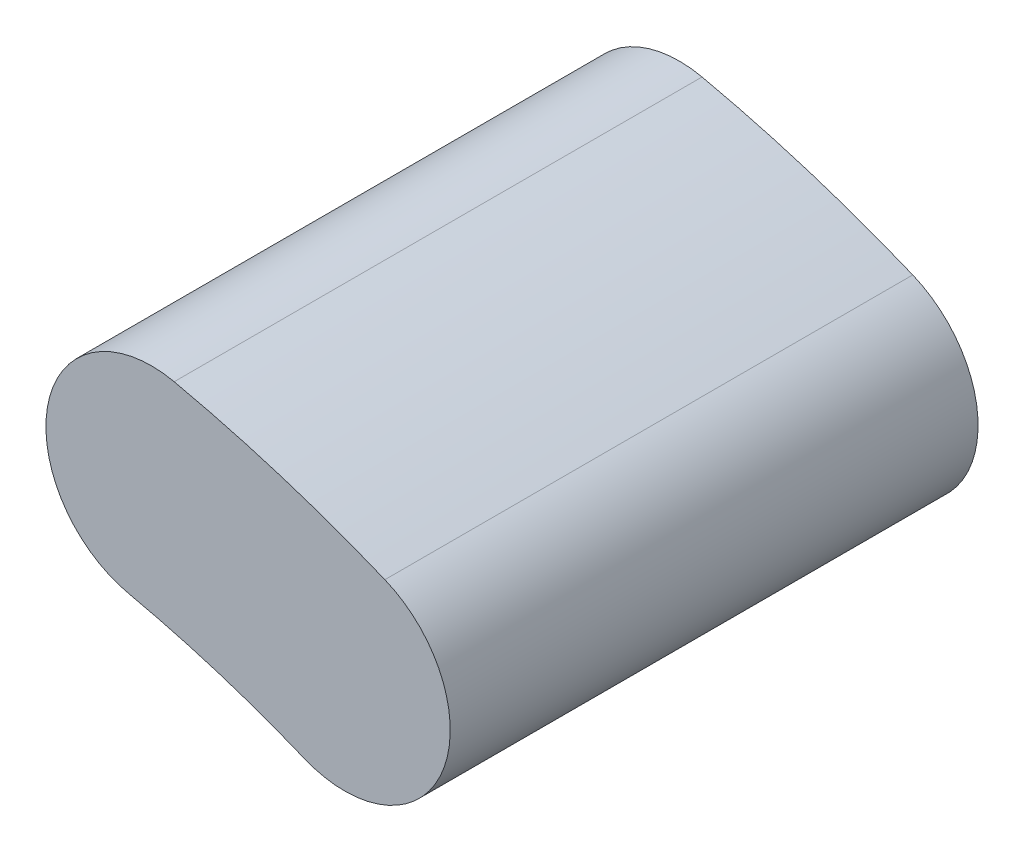
ISO-10303-21;
HEADER;
FILE_DESCRIPTION(('STEP AP214'),'2;1');
FILE_NAME('part.step','',(''),(''),'','','');
FILE_SCHEMA(('AUTOMOTIVE_DESIGN { 1 0 10303 214 1 1 1 1 }'));
ENDSEC;
DATA;
#1=APPLICATION_CONTEXT('core data for automotive mechanical design processes');
#2=APPLICATION_PROTOCOL_DEFINITION('international standard','automotive_design',2000,#1);
#3=PRODUCT_CONTEXT('',#1,'mechanical');
#4=PRODUCT('Part','Part','',(#3));
#5=PRODUCT_RELATED_PRODUCT_CATEGORY('part','',(#4));
#6=PRODUCT_DEFINITION_FORMATION('','',#4);
#7=PRODUCT_DEFINITION_CONTEXT('part definition',#1,'design');
#8=PRODUCT_DEFINITION('design','',#6,#7);
#9=PRODUCT_DEFINITION_SHAPE('','',#8);
#10=(LENGTH_UNIT() NAMED_UNIT(*) SI_UNIT(.MILLI.,.METRE.));
#11=(NAMED_UNIT(*) PLANE_ANGLE_UNIT() SI_UNIT($,.RADIAN.));
#12=(NAMED_UNIT(*) SI_UNIT($,.STERADIAN.) SOLID_ANGLE_UNIT());
#13=UNCERTAINTY_MEASURE_WITH_UNIT(LENGTH_MEASURE(1.E-05),#10,'distance_accuracy_value','');
#14=(GEOMETRIC_REPRESENTATION_CONTEXT(3) GLOBAL_UNCERTAINTY_ASSIGNED_CONTEXT((#13)) GLOBAL_UNIT_ASSIGNED_CONTEXT((#10,
#11,#12)) REPRESENTATION_CONTEXT('',''));
#15=CARTESIAN_POINT('',(0.,0.,0.));
#16=DIRECTION('',(0.,0.,1.));
#17=DIRECTION('',(1.,0.,0.));
#18=AXIS2_PLACEMENT_3D('',#15,#16,#17);
#19=CARTESIAN_POINT('',(83.8709562450853,203.385502675424,100.));
#20=DIRECTION('',(0.,0.,-1.));
#21=DIRECTION('',(-1.,0.,0.));
#22=AXIS2_PLACEMENT_3D('',#19,#20,#21);
#23=CYLINDRICAL_SURFACE('',#22,20.);
#24=CARTESIAN_POINT('',(83.8709562450853,203.385502675424,0.));
#25=DIRECTION('',(0.,0.,1.));
#26=DIRECTION('',(1.,0.,0.));
#27=AXIS2_PLACEMENT_3D('',#24,#25,#26);
#28=CIRCLE('',#27,20.);
#29=CARTESIAN_POINT('',(76.2463238591685,184.895911523113,0.));
#30=VERTEX_POINT('',#29);
#31=CARTESIAN_POINT('',(91.4955886310022,221.875093827735,0.));
#32=VERTEX_POINT('',#31);
#33=EDGE_CURVE('E100',#30,#32,#28,.T.);
#34=ORIENTED_EDGE('',*,*,#33,.T.);
#35=DIRECTION('',(0.,0.,-1.));
#36=VECTOR('',#35,1.);
#37=CARTESIAN_POINT('',(91.4955886310022,221.875093827735,100.));
#38=LINE('',#37,#36);
#39=CARTESIAN_POINT('',(91.4955886310022,221.875093827735,100.));
#40=VERTEX_POINT('',#39);
#41=EDGE_CURVE('E11',#40,#32,#38,.T.);
#42=ORIENTED_EDGE('',*,*,#41,.F.);
#43=CARTESIAN_POINT('',(83.8709562450853,203.385502675424,100.));
#44=DIRECTION('',(0.,0.,1.));
#45=DIRECTION('',(1.,0.,0.));
#46=AXIS2_PLACEMENT_3D('',#43,#44,#45);
#47=CIRCLE('',#46,20.);
#48=CARTESIAN_POINT('',(76.2463238591685,184.895911523113,100.));
#49=VERTEX_POINT('',#48);
#50=EDGE_CURVE('E88',#49,#40,#47,.T.);
#51=ORIENTED_EDGE('',*,*,#50,.F.);
#52=DIRECTION('',(0.,0.,-1.));
#53=VECTOR('',#52,1.);
#54=CARTESIAN_POINT('',(76.2463238591685,184.895911523113,100.));
#55=LINE('',#54,#53);
#56=EDGE_CURVE('E96',#49,#30,#55,.T.);
#57=ORIENTED_EDGE('',*,*,#56,.T.);
#58=EDGE_LOOP('',(#34,#42,#51,#57));
#59=FACE_BOUND('',#58,.T.);
#60=ADVANCED_FACE('F37',(#59),#23,.T.);
#61=CARTESIAN_POINT('',(0.,0.,100.));
#62=DIRECTION('',(0.,0.,-1.));
#63=DIRECTION('',(-1.,0.,0.));
#64=AXIS2_PLACEMENT_3D('',#61,#62,#63);
#65=CYLINDRICAL_SURFACE('',#64,240.);
#66=CARTESIAN_POINT('',(0.,0.,0.));
#67=DIRECTION('',(0.,0.,1.));
#68=DIRECTION('',(1.,0.,0.));
#69=AXIS2_PLACEMENT_3D('',#66,#67,#68);
#70=CIRCLE('',#69,240.);
#71=CARTESIAN_POINT('',(51.577359337361,234.392354832202,0.));
#72=VERTEX_POINT('',#71);
#73=EDGE_CURVE('E92',#32,#72,#70,.T.);
#74=ORIENTED_EDGE('',*,*,#73,.T.);
#75=DIRECTION('',(0.,0.,-1.));
#76=VECTOR('',#75,1.);
#77=CARTESIAN_POINT('',(51.577359337361,234.392354832202,100.));
#78=LINE('',#77,#76);
#79=CARTESIAN_POINT('',(51.577359337361,234.392354832202,100.));
#80=VERTEX_POINT('',#79);
#81=EDGE_CURVE('E45',#80,#72,#78,.T.);
#82=ORIENTED_EDGE('',*,*,#81,.F.);
#83=CARTESIAN_POINT('',(0.,0.,100.));
#84=DIRECTION('',(0.,0.,1.));
#85=DIRECTION('',(1.,0.,0.));
#86=AXIS2_PLACEMENT_3D('',#83,#84,#85);
#87=CIRCLE('',#86,240.);
#88=EDGE_CURVE('E83',#40,#80,#87,.T.);
#89=ORIENTED_EDGE('',*,*,#88,.F.);
#90=ORIENTED_EDGE('',*,*,#41,.T.);
#91=EDGE_LOOP('',(#74,#82,#89,#90));
#92=FACE_BOUND('',#91,.T.);
#93=ADVANCED_FACE('F91',(#92),#65,.T.);
#94=CARTESIAN_POINT('',(47.2792460592477,214.859658596186,100.));
#95=DIRECTION('',(0.,0.,-1.));
#96=DIRECTION('',(-1.,0.,0.));
#97=AXIS2_PLACEMENT_3D('',#94,#95,#96);
#98=CYLINDRICAL_SURFACE('',#97,20.);
#99=CARTESIAN_POINT('',(47.2792460592477,214.859658596186,0.));
#100=DIRECTION('',(0.,0.,1.));
#101=DIRECTION('',(1.,0.,0.));
#102=AXIS2_PLACEMENT_3D('',#99,#100,#101);
#103=CIRCLE('',#102,20.);
#104=CARTESIAN_POINT('',(42.9811327811343,195.326962360169,0.));
#105=VERTEX_POINT('',#104);
#106=EDGE_CURVE('E70',#72,#105,#103,.T.);
#107=ORIENTED_EDGE('',*,*,#106,.T.);
#108=DIRECTION('',(0.,0.,-1.));
#109=VECTOR('',#108,1.);
#110=CARTESIAN_POINT('',(42.9811327811343,195.326962360169,100.));
#111=LINE('',#110,#109);
#112=CARTESIAN_POINT('',(42.9811327811343,195.326962360169,100.));
#113=VERTEX_POINT('',#112);
#114=EDGE_CURVE('E93',#113,#105,#111,.T.);
#115=ORIENTED_EDGE('',*,*,#114,.F.);
#116=CARTESIAN_POINT('',(47.2792460592477,214.859658596186,100.));
#117=DIRECTION('',(0.,0.,1.));
#118=DIRECTION('',(1.,0.,0.));
#119=AXIS2_PLACEMENT_3D('',#116,#117,#118);
#120=CIRCLE('',#119,20.);
#121=EDGE_CURVE('E86',#80,#113,#120,.T.);
#122=ORIENTED_EDGE('',*,*,#121,.F.);
#123=ORIENTED_EDGE('',*,*,#81,.T.);
#124=EDGE_LOOP('',(#107,#115,#122,#123));
#125=FACE_BOUND('',#124,.T.);
#126=ADVANCED_FACE('F94',(#125),#98,.T.);
#127=CARTESIAN_POINT('',(0.,0.,100.));
#128=DIRECTION('',(0.,0.,-1.));
#129=DIRECTION('',(-1.,0.,0.));
#130=AXIS2_PLACEMENT_3D('',#127,#128,#129);
#131=CYLINDRICAL_SURFACE('',#130,200.);
#132=CARTESIAN_POINT('',(0.,0.,0.));
#133=DIRECTION('',(0.,0.,-1.));
#134=DIRECTION('',(1.,0.,0.));
#135=AXIS2_PLACEMENT_3D('',#132,#133,#134);
#136=CIRCLE('',#135,200.);
#137=EDGE_CURVE('E76',#105,#30,#136,.T.);
#138=ORIENTED_EDGE('',*,*,#137,.T.);
#139=ORIENTED_EDGE('',*,*,#56,.F.);
#140=CARTESIAN_POINT('',(0.,0.,100.));
#141=DIRECTION('',(0.,0.,-1.));
#142=DIRECTION('',(1.,0.,0.));
#143=AXIS2_PLACEMENT_3D('',#140,#141,#142);
#144=CIRCLE('',#143,200.);
#145=EDGE_CURVE('E53',#113,#49,#144,.T.);
#146=ORIENTED_EDGE('',*,*,#145,.F.);
#147=ORIENTED_EDGE('',*,*,#114,.T.);
#148=EDGE_LOOP('',(#138,#139,#146,#147));
#149=FACE_BOUND('',#148,.T.);
#150=ADVANCED_FACE('F107',(#149),#131,.F.);
#151=CARTESIAN_POINT('',(41.9354781225427,101.692751337712,100.));
#152=DIRECTION('',(0.,0.,1.));
#153=DIRECTION('',(1.,0.,0.));
#154=AXIS2_PLACEMENT_3D('',#151,#152,#153);
#155=PLANE('',#154);
#156=ORIENTED_EDGE('',*,*,#50,.T.);
#157=ORIENTED_EDGE('',*,*,#88,.T.);
#158=ORIENTED_EDGE('',*,*,#121,.T.);
#159=ORIENTED_EDGE('',*,*,#145,.T.);
#160=EDGE_LOOP('',(#156,#157,#158,#159));
#161=FACE_BOUND('',#160,.T.);
#162=ADVANCED_FACE('F84',(#161),#155,.T.);
#163=CARTESIAN_POINT('',(41.9354781225427,101.692751337712,0.));
#164=DIRECTION('',(0.,0.,1.));
#165=DIRECTION('',(1.,0.,0.));
#166=AXIS2_PLACEMENT_3D('',#163,#164,#165);
#167=PLANE('',#166);
#168=ORIENTED_EDGE('',*,*,#33,.F.);
#169=ORIENTED_EDGE('',*,*,#137,.F.);
#170=ORIENTED_EDGE('',*,*,#106,.F.);
#171=ORIENTED_EDGE('',*,*,#73,.F.);
#172=EDGE_LOOP('',(#168,#169,#170,#171));
#173=FACE_BOUND('',#172,.T.);
#174=ADVANCED_FACE('F110',(#173),#167,.F.);
#175=CLOSED_SHELL('',(#60,#93,#126,#150,#162,#174));
#176=MANIFOLD_SOLID_BREP('B2',#175);
#177=ADVANCED_BREP_SHAPE_REPRESENTATION('',(#18,#176),#14);
#178=SHAPE_DEFINITION_REPRESENTATION(#9,#177);
ENDSEC;
END-ISO-10303-21;
